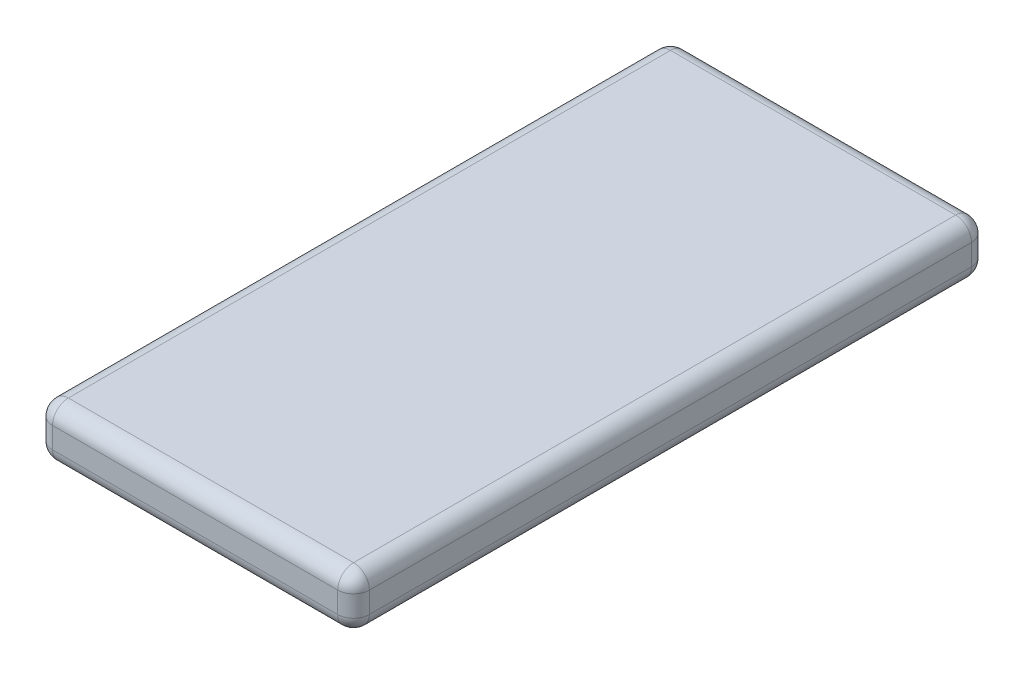
ISO-10303-21;
HEADER;
FILE_DESCRIPTION(('STEP AP214'),'2;1');
FILE_NAME('part.step','',(''),(''),'','','');
FILE_SCHEMA(('AUTOMOTIVE_DESIGN { 1 0 10303 214 1 1 1 1 }'));
ENDSEC;
DATA;
#1=APPLICATION_CONTEXT('core data for automotive mechanical design processes');
#2=APPLICATION_PROTOCOL_DEFINITION('international standard','automotive_design',2000,#1);
#3=PRODUCT_CONTEXT('',#1,'mechanical');
#4=PRODUCT('Part','Part','',(#3));
#5=PRODUCT_RELATED_PRODUCT_CATEGORY('part','',(#4));
#6=PRODUCT_DEFINITION_FORMATION('','',#4);
#7=PRODUCT_DEFINITION_CONTEXT('part definition',#1,'design');
#8=PRODUCT_DEFINITION('design','',#6,#7);
#9=PRODUCT_DEFINITION_SHAPE('','',#8);
#10=(LENGTH_UNIT() NAMED_UNIT(*) SI_UNIT(.MILLI.,.METRE.));
#11=(NAMED_UNIT(*) PLANE_ANGLE_UNIT() SI_UNIT($,.RADIAN.));
#12=(NAMED_UNIT(*) SI_UNIT($,.STERADIAN.) SOLID_ANGLE_UNIT());
#13=UNCERTAINTY_MEASURE_WITH_UNIT(LENGTH_MEASURE(1.E-05),#10,'distance_accuracy_value','');
#14=(GEOMETRIC_REPRESENTATION_CONTEXT(3) GLOBAL_UNCERTAINTY_ASSIGNED_CONTEXT((#13)) GLOBAL_UNIT_ASSIGNED_CONTEXT((#10,
#11,#12)) REPRESENTATION_CONTEXT('',''));
#15=CARTESIAN_POINT('',(0.,0.,0.));
#16=DIRECTION('',(0.,0.,1.));
#17=DIRECTION('',(1.,0.,0.));
#18=AXIS2_PLACEMENT_3D('',#15,#16,#17);
#19=CARTESIAN_POINT('',(-300.,100.,-600.));
#20=DIRECTION('',(1.,0.,0.));
#21=DIRECTION('',(0.,0.,-1.));
#22=AXIS2_PLACEMENT_3D('',#19,#20,#21);
#23=PLANE('',#22);
#24=DIRECTION('',(0.,0.,1.));
#25=VECTOR('',#24,1.);
#26=CARTESIAN_POINT('',(-300.,30.,600.));
#27=LINE('',#26,#25);
#28=CARTESIAN_POINT('',(-300.,30.,-570.));
#29=VERTEX_POINT('',#28);
#30=CARTESIAN_POINT('',(-300.,30.,570.));
#31=VERTEX_POINT('',#30);
#32=EDGE_CURVE('E327',#29,#31,#27,.T.);
#33=ORIENTED_EDGE('',*,*,#32,.T.);
#34=DIRECTION('',(0.,-1.,0.));
#35=VECTOR('',#34,1.);
#36=CARTESIAN_POINT('',(-300.,100.,570.));
#37=LINE('',#36,#35);
#38=CARTESIAN_POINT('',(-300.,70.,570.));
#39=VERTEX_POINT('',#38);
#40=EDGE_CURVE('E240',#31,#39,#37,.F.);
#41=ORIENTED_EDGE('',*,*,#40,.T.);
#42=DIRECTION('',(0.,0.,1.));
#43=VECTOR('',#42,1.);
#44=CARTESIAN_POINT('',(-300.,70.,-600.));
#45=LINE('',#44,#43);
#46=CARTESIAN_POINT('',(-300.,70.,-570.));
#47=VERTEX_POINT('',#46);
#48=EDGE_CURVE('E318',#39,#47,#45,.F.);
#49=ORIENTED_EDGE('',*,*,#48,.T.);
#50=DIRECTION('',(0.,-1.,0.));
#51=VECTOR('',#50,1.);
#52=CARTESIAN_POINT('',(-300.,100.,-570.));
#53=LINE('',#52,#51);
#54=EDGE_CURVE('E321',#47,#29,#53,.T.);
#55=ORIENTED_EDGE('',*,*,#54,.T.);
#56=EDGE_LOOP('',(#33,#41,#49,#55));
#57=FACE_BOUND('',#56,.T.);
#58=ADVANCED_FACE('F39',(#57),#23,.F.);
#59=CARTESIAN_POINT('',(300.,100.,600.));
#60=DIRECTION('',(0.,0.,-1.));
#61=DIRECTION('',(-1.,0.,0.));
#62=AXIS2_PLACEMENT_3D('',#59,#60,#61);
#63=PLANE('',#62);
#64=DIRECTION('',(0.,-1.,0.));
#65=VECTOR('',#64,1.);
#66=CARTESIAN_POINT('',(-270.,100.,600.));
#67=LINE('',#66,#65);
#68=CARTESIAN_POINT('',(-270.,70.,600.));
#69=VERTEX_POINT('',#68);
#70=CARTESIAN_POINT('',(-270.,30.,600.));
#71=VERTEX_POINT('',#70);
#72=EDGE_CURVE('E139',#69,#71,#67,.T.);
#73=ORIENTED_EDGE('',*,*,#72,.T.);
#74=DIRECTION('',(1.,0.,0.));
#75=VECTOR('',#74,1.);
#76=CARTESIAN_POINT('',(300.,30.,600.));
#77=LINE('',#76,#75);
#78=CARTESIAN_POINT('',(270.,30.,600.));
#79=VERTEX_POINT('',#78);
#80=EDGE_CURVE('E134',#71,#79,#77,.T.);
#81=ORIENTED_EDGE('',*,*,#80,.T.);
#82=DIRECTION('',(0.,-1.,0.));
#83=VECTOR('',#82,1.);
#84=CARTESIAN_POINT('',(270.,100.,600.));
#85=LINE('',#84,#83);
#86=CARTESIAN_POINT('',(270.,70.,600.));
#87=VERTEX_POINT('',#86);
#88=EDGE_CURVE('E128',#79,#87,#85,.F.);
#89=ORIENTED_EDGE('',*,*,#88,.T.);
#90=DIRECTION('',(1.,0.,0.));
#91=VECTOR('',#90,1.);
#92=CARTESIAN_POINT('',(300.,70.,600.));
#93=LINE('',#92,#91);
#94=EDGE_CURVE('E131',#87,#69,#93,.F.);
#95=ORIENTED_EDGE('',*,*,#94,.T.);
#96=EDGE_LOOP('',(#73,#81,#89,#95));
#97=FACE_BOUND('',#96,.T.);
#98=ADVANCED_FACE('F130',(#97),#63,.F.);
#99=CARTESIAN_POINT('',(300.,100.,-600.));
#100=DIRECTION('',(-1.,0.,0.));
#101=DIRECTION('',(0.,0.,1.));
#102=AXIS2_PLACEMENT_3D('',#99,#100,#101);
#103=PLANE('',#102);
#104=DIRECTION('',(0.,-1.,0.));
#105=VECTOR('',#104,1.);
#106=CARTESIAN_POINT('',(300.,100.,570.));
#107=LINE('',#106,#105);
#108=CARTESIAN_POINT('',(300.,70.,570.));
#109=VERTEX_POINT('',#108);
#110=CARTESIAN_POINT('',(300.,30.,570.));
#111=VERTEX_POINT('',#110);
#112=EDGE_CURVE('E163',#109,#111,#107,.T.);
#113=ORIENTED_EDGE('',*,*,#112,.T.);
#114=DIRECTION('',(0.,0.,-1.));
#115=VECTOR('',#114,1.);
#116=CARTESIAN_POINT('',(300.,30.,-600.));
#117=LINE('',#116,#115);
#118=CARTESIAN_POINT('',(300.,30.,-570.));
#119=VERTEX_POINT('',#118);
#120=EDGE_CURVE('E264',#111,#119,#117,.T.);
#121=ORIENTED_EDGE('',*,*,#120,.T.);
#122=DIRECTION('',(0.,-1.,0.));
#123=VECTOR('',#122,1.);
#124=CARTESIAN_POINT('',(300.,100.,-570.));
#125=LINE('',#124,#123);
#126=CARTESIAN_POINT('',(300.,70.,-570.));
#127=VERTEX_POINT('',#126);
#128=EDGE_CURVE('E255',#119,#127,#125,.F.);
#129=ORIENTED_EDGE('',*,*,#128,.T.);
#130=DIRECTION('',(0.,0.,-1.));
#131=VECTOR('',#130,1.);
#132=CARTESIAN_POINT('',(300.,70.,-600.));
#133=LINE('',#132,#131);
#134=EDGE_CURVE('E251',#127,#109,#133,.F.);
#135=ORIENTED_EDGE('',*,*,#134,.T.);
#136=EDGE_LOOP('',(#113,#121,#129,#135));
#137=FACE_BOUND('',#136,.T.);
#138=ADVANCED_FACE('F378',(#137),#103,.F.);
#139=CARTESIAN_POINT('',(300.,100.,-600.));
#140=DIRECTION('',(0.,0.,1.));
#141=DIRECTION('',(1.,0.,0.));
#142=AXIS2_PLACEMENT_3D('',#139,#140,#141);
#143=PLANE('',#142);
#144=DIRECTION('',(-1.,0.,0.));
#145=VECTOR('',#144,1.);
#146=CARTESIAN_POINT('',(-300.,30.,-600.));
#147=LINE('',#146,#145);
#148=CARTESIAN_POINT('',(270.,30.,-600.));
#149=VERTEX_POINT('',#148);
#150=CARTESIAN_POINT('',(-270.,30.,-600.));
#151=VERTEX_POINT('',#150);
#152=EDGE_CURVE('E246',#149,#151,#147,.T.);
#153=ORIENTED_EDGE('',*,*,#152,.T.);
#154=DIRECTION('',(0.,-1.,0.));
#155=VECTOR('',#154,1.);
#156=CARTESIAN_POINT('',(-270.,100.,-600.));
#157=LINE('',#156,#155);
#158=CARTESIAN_POINT('',(-270.,70.,-600.));
#159=VERTEX_POINT('',#158);
#160=EDGE_CURVE('E243',#151,#159,#157,.F.);
#161=ORIENTED_EDGE('',*,*,#160,.T.);
#162=DIRECTION('',(-1.,0.,0.));
#163=VECTOR('',#162,1.);
#164=CARTESIAN_POINT('',(300.,70.,-600.));
#165=LINE('',#164,#163);
#166=CARTESIAN_POINT('',(270.,70.,-600.));
#167=VERTEX_POINT('',#166);
#168=EDGE_CURVE('E235',#159,#167,#165,.F.);
#169=ORIENTED_EDGE('',*,*,#168,.T.);
#170=DIRECTION('',(0.,-1.,0.));
#171=VECTOR('',#170,1.);
#172=CARTESIAN_POINT('',(270.,100.,-600.));
#173=LINE('',#172,#171);
#174=EDGE_CURVE('E239',#167,#149,#173,.T.);
#175=ORIENTED_EDGE('',*,*,#174,.T.);
#176=EDGE_LOOP('',(#153,#161,#169,#175));
#177=FACE_BOUND('',#176,.T.);
#178=ADVANCED_FACE('F244',(#177),#143,.F.);
#179=CARTESIAN_POINT('',(0.,100.,0.));
#180=DIRECTION('',(0.,-1.,0.));
#181=DIRECTION('',(0.,0.,-1.));
#182=AXIS2_PLACEMENT_3D('',#179,#180,#181);
#183=PLANE('',#182);
#184=DIRECTION('',(0.,0.,-1.));
#185=VECTOR('',#184,1.);
#186=CARTESIAN_POINT('',(270.,100.,0.));
#187=LINE('',#186,#185);
#188=CARTESIAN_POINT('',(270.,100.,570.));
#189=VERTEX_POINT('',#188);
#190=CARTESIAN_POINT('',(270.,100.,-570.));
#191=VERTEX_POINT('',#190);
#192=EDGE_CURVE('E49',#189,#191,#187,.T.);
#193=ORIENTED_EDGE('',*,*,#192,.T.);
#194=DIRECTION('',(-1.,0.,0.));
#195=VECTOR('',#194,1.);
#196=CARTESIAN_POINT('',(-1.0547118733939E-13,100.,-570.));
#197=LINE('',#196,#195);
#198=CARTESIAN_POINT('',(-270.,100.,-570.));
#199=VERTEX_POINT('',#198);
#200=EDGE_CURVE('E11',#191,#199,#197,.T.);
#201=ORIENTED_EDGE('',*,*,#200,.T.);
#202=DIRECTION('',(0.,0.,1.));
#203=VECTOR('',#202,1.);
#204=CARTESIAN_POINT('',(-270.,100.,0.));
#205=LINE('',#204,#203);
#206=CARTESIAN_POINT('',(-270.,100.,570.));
#207=VERTEX_POINT('',#206);
#208=EDGE_CURVE('E267',#199,#207,#205,.T.);
#209=ORIENTED_EDGE('',*,*,#208,.T.);
#210=DIRECTION('',(1.,0.,0.));
#211=VECTOR('',#210,1.);
#212=CARTESIAN_POINT('',(0.,100.,570.));
#213=LINE('',#212,#211);
#214=EDGE_CURVE('E60',#207,#189,#213,.T.);
#215=ORIENTED_EDGE('',*,*,#214,.T.);
#216=EDGE_LOOP('',(#193,#201,#209,#215));
#217=FACE_BOUND('',#216,.T.);
#218=ADVANCED_FACE('F536',(#217),#183,.F.);
#219=CARTESIAN_POINT('',(0.,0.,0.));
#220=DIRECTION('',(0.,-1.,0.));
#221=DIRECTION('',(0.,0.,-1.));
#222=AXIS2_PLACEMENT_3D('',#219,#220,#221);
#223=PLANE('',#222);
#224=DIRECTION('',(0.,0.,-1.));
#225=VECTOR('',#224,1.);
#226=CARTESIAN_POINT('',(270.,0.,600.));
#227=LINE('',#226,#225);
#228=CARTESIAN_POINT('',(270.,0.,-570.));
#229=VERTEX_POINT('',#228);
#230=CARTESIAN_POINT('',(270.,0.,570.));
#231=VERTEX_POINT('',#230);
#232=EDGE_CURVE('E313',#229,#231,#227,.F.);
#233=ORIENTED_EDGE('',*,*,#232,.T.);
#234=DIRECTION('',(1.,0.,0.));
#235=VECTOR('',#234,1.);
#236=CARTESIAN_POINT('',(-300.,0.,570.));
#237=LINE('',#236,#235);
#238=CARTESIAN_POINT('',(-270.,0.,570.));
#239=VERTEX_POINT('',#238);
#240=EDGE_CURVE('E307',#231,#239,#237,.F.);
#241=ORIENTED_EDGE('',*,*,#240,.T.);
#242=DIRECTION('',(0.,0.,1.));
#243=VECTOR('',#242,1.);
#244=CARTESIAN_POINT('',(-270.,0.,-600.));
#245=LINE('',#244,#243);
#246=CARTESIAN_POINT('',(-270.,0.,-570.));
#247=VERTEX_POINT('',#246);
#248=EDGE_CURVE('E300',#239,#247,#245,.F.);
#249=ORIENTED_EDGE('',*,*,#248,.T.);
#250=DIRECTION('',(-1.,0.,0.));
#251=VECTOR('',#250,1.);
#252=CARTESIAN_POINT('',(300.,0.,-570.));
#253=LINE('',#252,#251);
#254=EDGE_CURVE('E308',#247,#229,#253,.F.);
#255=ORIENTED_EDGE('',*,*,#254,.T.);
#256=EDGE_LOOP('',(#233,#241,#249,#255));
#257=FACE_BOUND('',#256,.T.);
#258=ADVANCED_FACE('F311',(#257),#223,.T.);
#259=CARTESIAN_POINT('',(-1.0547118733939E-13,70.,-570.));
#260=DIRECTION('',(-1.,0.,0.));
#261=DIRECTION('',(0.,0.,1.));
#262=AXIS2_PLACEMENT_3D('',#259,#260,#261);
#263=CYLINDRICAL_SURFACE('',#262,30.);
#264=CARTESIAN_POINT('',(-270.,70.,-570.));
#265=DIRECTION('',(-1.,0.,0.));
#266=DIRECTION('',(0.,0.,1.));
#267=AXIS2_PLACEMENT_3D('',#264,#265,#266);
#268=CIRCLE('',#267,30.);
#269=EDGE_CURVE('E43',#199,#159,#268,.T.);
#270=ORIENTED_EDGE('',*,*,#269,.F.);
#271=ORIENTED_EDGE('',*,*,#200,.F.);
#272=CARTESIAN_POINT('',(270.,70.,-570.));
#273=DIRECTION('',(1.,0.,0.));
#274=DIRECTION('',(0.,0.,-1.));
#275=AXIS2_PLACEMENT_3D('',#272,#273,#274);
#276=CIRCLE('',#275,30.);
#277=EDGE_CURVE('E218',#167,#191,#276,.T.);
#278=ORIENTED_EDGE('',*,*,#277,.F.);
#279=ORIENTED_EDGE('',*,*,#168,.F.);
#280=EDGE_LOOP('',(#270,#271,#278,#279));
#281=FACE_BOUND('',#280,.T.);
#282=ADVANCED_FACE('F41',(#281),#263,.T.);
#283=CARTESIAN_POINT('',(-270.,70.,-570.));
#284=DIRECTION('',(0.,0.,1.));
#285=DIRECTION('',(1.,0.,0.));
#286=AXIS2_PLACEMENT_3D('',#283,#284,#285);
#287=SPHERICAL_SURFACE('',#286,30.);
#288=CARTESIAN_POINT('',(-270.,70.,-570.));
#289=DIRECTION('',(0.,0.,-1.));
#290=DIRECTION('',(0.,1.,0.));
#291=AXIS2_PLACEMENT_3D('',#288,#289,#290);
#292=CIRCLE('',#291,30.);
#293=EDGE_CURVE('E212',#199,#47,#292,.F.);
#294=ORIENTED_EDGE('',*,*,#293,.F.);
#295=ORIENTED_EDGE('',*,*,#269,.T.);
#296=CARTESIAN_POINT('',(-270.,70.,-570.));
#297=DIRECTION('',(0.,1.,0.));
#298=DIRECTION('',(0.,0.,1.));
#299=AXIS2_PLACEMENT_3D('',#296,#297,#298);
#300=CIRCLE('',#299,30.);
#301=EDGE_CURVE('E216',#47,#159,#300,.F.);
#302=ORIENTED_EDGE('',*,*,#301,.F.);
#303=EDGE_LOOP('',(#294,#295,#302));
#304=FACE_BOUND('',#303,.T.);
#305=ADVANCED_FACE('F232',(#304),#287,.T.);
#306=CARTESIAN_POINT('',(270.,70.,-570.));
#307=DIRECTION('',(0.,0.,1.));
#308=DIRECTION('',(1.,0.,0.));
#309=AXIS2_PLACEMENT_3D('',#306,#307,#308);
#310=SPHERICAL_SURFACE('',#309,30.);
#311=CARTESIAN_POINT('',(270.,70.,-570.));
#312=DIRECTION('',(0.,1.,0.));
#313=DIRECTION('',(0.,0.,1.));
#314=AXIS2_PLACEMENT_3D('',#311,#312,#313);
#315=CIRCLE('',#314,30.);
#316=EDGE_CURVE('E204',#167,#127,#315,.F.);
#317=ORIENTED_EDGE('',*,*,#316,.F.);
#318=ORIENTED_EDGE('',*,*,#277,.T.);
#319=CARTESIAN_POINT('',(270.,70.,-570.));
#320=DIRECTION('',(0.,0.,-1.));
#321=DIRECTION('',(-1.,0.,0.));
#322=AXIS2_PLACEMENT_3D('',#319,#320,#321);
#323=CIRCLE('',#322,30.);
#324=EDGE_CURVE('E208',#127,#191,#323,.F.);
#325=ORIENTED_EDGE('',*,*,#324,.F.);
#326=EDGE_LOOP('',(#317,#318,#325));
#327=FACE_BOUND('',#326,.T.);
#328=ADVANCED_FACE('F509',(#327),#310,.T.);
#329=CARTESIAN_POINT('',(-270.,100.,-570.));
#330=DIRECTION('',(0.,-1.,0.));
#331=DIRECTION('',(0.,0.,-1.));
#332=AXIS2_PLACEMENT_3D('',#329,#330,#331);
#333=CYLINDRICAL_SURFACE('',#332,30.);
#334=ORIENTED_EDGE('',*,*,#301,.T.);
#335=ORIENTED_EDGE('',*,*,#160,.F.);
#336=CARTESIAN_POINT('',(-270.,30.,-570.));
#337=DIRECTION('',(0.,-1.,0.));
#338=DIRECTION('',(0.,0.,-1.));
#339=AXIS2_PLACEMENT_3D('',#336,#337,#338);
#340=CIRCLE('',#339,30.);
#341=EDGE_CURVE('E196',#29,#151,#340,.T.);
#342=ORIENTED_EDGE('',*,*,#341,.F.);
#343=ORIENTED_EDGE('',*,*,#54,.F.);
#344=EDGE_LOOP('',(#334,#335,#342,#343));
#345=FACE_BOUND('',#344,.T.);
#346=ADVANCED_FACE('F360',(#345),#333,.T.);
#347=CARTESIAN_POINT('',(-270.,70.,0.));
#348=DIRECTION('',(0.,0.,1.));
#349=DIRECTION('',(1.,0.,0.));
#350=AXIS2_PLACEMENT_3D('',#347,#348,#349);
#351=CYLINDRICAL_SURFACE('',#350,30.);
#352=ORIENTED_EDGE('',*,*,#293,.T.);
#353=ORIENTED_EDGE('',*,*,#48,.F.);
#354=CARTESIAN_POINT('',(-270.,70.,570.));
#355=DIRECTION('',(0.,0.,1.));
#356=DIRECTION('',(1.,0.,0.));
#357=AXIS2_PLACEMENT_3D('',#354,#355,#356);
#358=CIRCLE('',#357,30.);
#359=EDGE_CURVE('E192',#207,#39,#358,.T.);
#360=ORIENTED_EDGE('',*,*,#359,.F.);
#361=ORIENTED_EDGE('',*,*,#208,.F.);
#362=EDGE_LOOP('',(#352,#353,#360,#361));
#363=FACE_BOUND('',#362,.T.);
#364=ADVANCED_FACE('F493',(#363),#351,.T.);
#365=CARTESIAN_POINT('',(0.,70.,570.));
#366=DIRECTION('',(1.,0.,0.));
#367=DIRECTION('',(0.,0.,-1.));
#368=AXIS2_PLACEMENT_3D('',#365,#366,#367);
#369=CYLINDRICAL_SURFACE('',#368,30.);
#370=CARTESIAN_POINT('',(270.,70.,570.));
#371=DIRECTION('',(1.,0.,0.));
#372=DIRECTION('',(0.,0.,-1.));
#373=AXIS2_PLACEMENT_3D('',#370,#371,#372);
#374=CIRCLE('',#373,30.);
#375=EDGE_CURVE('E145',#189,#87,#374,.T.);
#376=ORIENTED_EDGE('',*,*,#375,.F.);
#377=ORIENTED_EDGE('',*,*,#214,.F.);
#378=CARTESIAN_POINT('',(-270.,70.,570.));
#379=DIRECTION('',(-1.,0.,0.));
#380=DIRECTION('',(0.,-1.,0.));
#381=AXIS2_PLACEMENT_3D('',#378,#379,#380);
#382=CIRCLE('',#381,30.);
#383=EDGE_CURVE('E148',#69,#207,#382,.T.);
#384=ORIENTED_EDGE('',*,*,#383,.F.);
#385=ORIENTED_EDGE('',*,*,#94,.F.);
#386=EDGE_LOOP('',(#376,#377,#384,#385));
#387=FACE_BOUND('',#386,.T.);
#388=ADVANCED_FACE('F144',(#387),#369,.T.);
#389=CARTESIAN_POINT('',(270.,70.,0.));
#390=DIRECTION('',(0.,0.,-1.));
#391=DIRECTION('',(-1.,0.,0.));
#392=AXIS2_PLACEMENT_3D('',#389,#390,#391);
#393=CYLINDRICAL_SURFACE('',#392,30.);
#394=ORIENTED_EDGE('',*,*,#324,.T.);
#395=ORIENTED_EDGE('',*,*,#192,.F.);
#396=CARTESIAN_POINT('',(270.,70.,570.));
#397=DIRECTION('',(0.,0.,1.));
#398=DIRECTION('',(0.,-1.,0.));
#399=AXIS2_PLACEMENT_3D('',#396,#397,#398);
#400=CIRCLE('',#399,30.);
#401=EDGE_CURVE('E158',#109,#189,#400,.T.);
#402=ORIENTED_EDGE('',*,*,#401,.F.);
#403=ORIENTED_EDGE('',*,*,#134,.F.);
#404=EDGE_LOOP('',(#394,#395,#402,#403));
#405=FACE_BOUND('',#404,.T.);
#406=ADVANCED_FACE('F477',(#405),#393,.T.);
#407=CARTESIAN_POINT('',(270.,100.,-570.));
#408=DIRECTION('',(0.,-1.,0.));
#409=DIRECTION('',(0.,0.,-1.));
#410=AXIS2_PLACEMENT_3D('',#407,#408,#409);
#411=CYLINDRICAL_SURFACE('',#410,30.);
#412=ORIENTED_EDGE('',*,*,#316,.T.);
#413=ORIENTED_EDGE('',*,*,#128,.F.);
#414=CARTESIAN_POINT('',(270.,30.,-570.));
#415=DIRECTION('',(0.,-1.,0.));
#416=DIRECTION('',(0.,0.,-1.));
#417=AXIS2_PLACEMENT_3D('',#414,#415,#416);
#418=CIRCLE('',#417,30.);
#419=EDGE_CURVE('E184',#149,#119,#418,.T.);
#420=ORIENTED_EDGE('',*,*,#419,.F.);
#421=ORIENTED_EDGE('',*,*,#174,.F.);
#422=EDGE_LOOP('',(#412,#413,#420,#421));
#423=FACE_BOUND('',#422,.T.);
#424=ADVANCED_FACE('F341',(#423),#411,.T.);
#425=CARTESIAN_POINT('',(300.,30.,-570.));
#426=DIRECTION('',(1.,0.,0.));
#427=DIRECTION('',(0.,0.,-1.));
#428=AXIS2_PLACEMENT_3D('',#425,#426,#427);
#429=CYLINDRICAL_SURFACE('',#428,30.);
#430=CARTESIAN_POINT('',(-270.,30.,-570.));
#431=DIRECTION('',(-1.,0.,0.));
#432=DIRECTION('',(0.,0.,1.));
#433=AXIS2_PLACEMENT_3D('',#430,#431,#432);
#434=CIRCLE('',#433,30.);
#435=EDGE_CURVE('E200',#151,#247,#434,.T.);
#436=ORIENTED_EDGE('',*,*,#435,.F.);
#437=ORIENTED_EDGE('',*,*,#152,.F.);
#438=CARTESIAN_POINT('',(270.,30.,-570.));
#439=DIRECTION('',(1.,0.,0.));
#440=DIRECTION('',(0.,0.,-1.));
#441=AXIS2_PLACEMENT_3D('',#438,#439,#440);
#442=CIRCLE('',#441,30.);
#443=EDGE_CURVE('E180',#229,#149,#442,.T.);
#444=ORIENTED_EDGE('',*,*,#443,.F.);
#445=ORIENTED_EDGE('',*,*,#254,.F.);
#446=EDGE_LOOP('',(#436,#437,#444,#445));
#447=FACE_BOUND('',#446,.T.);
#448=ADVANCED_FACE('F338',(#447),#429,.T.);
#449=CARTESIAN_POINT('',(-270.,30.,-570.));
#450=DIRECTION('',(0.,0.,1.));
#451=DIRECTION('',(1.,0.,0.));
#452=AXIS2_PLACEMENT_3D('',#449,#450,#451);
#453=SPHERICAL_SURFACE('',#452,30.);
#454=ORIENTED_EDGE('',*,*,#341,.T.);
#455=ORIENTED_EDGE('',*,*,#435,.T.);
#456=CARTESIAN_POINT('',(-270.,30.,-570.));
#457=DIRECTION('',(0.,0.,-1.));
#458=DIRECTION('',(-1.,0.,0.));
#459=AXIS2_PLACEMENT_3D('',#456,#457,#458);
#460=CIRCLE('',#459,30.);
#461=EDGE_CURVE('E170',#29,#247,#460,.F.);
#462=ORIENTED_EDGE('',*,*,#461,.F.);
#463=EDGE_LOOP('',(#454,#455,#462));
#464=FACE_BOUND('',#463,.T.);
#465=ADVANCED_FACE('F362',(#464),#453,.T.);
#466=CARTESIAN_POINT('',(-270.,70.,570.));
#467=DIRECTION('',(0.,0.,1.));
#468=DIRECTION('',(1.,0.,0.));
#469=AXIS2_PLACEMENT_3D('',#466,#467,#468);
#470=SPHERICAL_SURFACE('',#469,30.);
#471=ORIENTED_EDGE('',*,*,#383,.T.);
#472=ORIENTED_EDGE('',*,*,#359,.T.);
#473=CARTESIAN_POINT('',(-270.,70.,570.));
#474=DIRECTION('',(0.,1.,0.));
#475=DIRECTION('',(0.,0.,1.));
#476=AXIS2_PLACEMENT_3D('',#473,#474,#475);
#477=CIRCLE('',#476,30.);
#478=EDGE_CURVE('E165',#69,#39,#477,.F.);
#479=ORIENTED_EDGE('',*,*,#478,.F.);
#480=EDGE_LOOP('',(#471,#472,#479));
#481=FACE_BOUND('',#480,.T.);
#482=ADVANCED_FACE('F364',(#481),#470,.T.);
#483=CARTESIAN_POINT('',(270.,70.,570.));
#484=DIRECTION('',(0.,0.,1.));
#485=DIRECTION('',(1.,0.,0.));
#486=AXIS2_PLACEMENT_3D('',#483,#484,#485);
#487=SPHERICAL_SURFACE('',#486,30.);
#488=ORIENTED_EDGE('',*,*,#401,.T.);
#489=ORIENTED_EDGE('',*,*,#375,.T.);
#490=CARTESIAN_POINT('',(270.,70.,570.));
#491=DIRECTION('',(0.,1.,0.));
#492=DIRECTION('',(0.,0.,1.));
#493=AXIS2_PLACEMENT_3D('',#490,#491,#492);
#494=CIRCLE('',#493,30.);
#495=EDGE_CURVE('E155',#109,#87,#494,.F.);
#496=ORIENTED_EDGE('',*,*,#495,.F.);
#497=EDGE_LOOP('',(#488,#489,#496));
#498=FACE_BOUND('',#497,.T.);
#499=ADVANCED_FACE('F154',(#498),#487,.T.);
#500=CARTESIAN_POINT('',(270.,30.,-570.));
#501=DIRECTION('',(0.,0.,1.));
#502=DIRECTION('',(1.,0.,0.));
#503=AXIS2_PLACEMENT_3D('',#500,#501,#502);
#504=SPHERICAL_SURFACE('',#503,30.);
#505=ORIENTED_EDGE('',*,*,#443,.T.);
#506=ORIENTED_EDGE('',*,*,#419,.T.);
#507=CARTESIAN_POINT('',(270.,30.,-570.));
#508=DIRECTION('',(0.,0.,-1.));
#509=DIRECTION('',(-1.,0.,0.));
#510=AXIS2_PLACEMENT_3D('',#507,#508,#509);
#511=CIRCLE('',#510,30.);
#512=EDGE_CURVE('E166',#229,#119,#511,.F.);
#513=ORIENTED_EDGE('',*,*,#512,.F.);
#514=EDGE_LOOP('',(#505,#506,#513));
#515=FACE_BOUND('',#514,.T.);
#516=ADVANCED_FACE('F343',(#515),#504,.T.);
#517=CARTESIAN_POINT('',(-270.,30.,-600.));
#518=DIRECTION('',(0.,0.,-1.));
#519=DIRECTION('',(-1.,0.,0.));
#520=AXIS2_PLACEMENT_3D('',#517,#518,#519);
#521=CYLINDRICAL_SURFACE('',#520,30.);
#522=ORIENTED_EDGE('',*,*,#461,.T.);
#523=ORIENTED_EDGE('',*,*,#248,.F.);
#524=CARTESIAN_POINT('',(-270.,30.,570.));
#525=DIRECTION('',(0.,0.,1.));
#526=DIRECTION('',(1.,0.,0.));
#527=AXIS2_PLACEMENT_3D('',#524,#525,#526);
#528=CIRCLE('',#527,30.);
#529=EDGE_CURVE('E173',#31,#239,#528,.T.);
#530=ORIENTED_EDGE('',*,*,#529,.F.);
#531=ORIENTED_EDGE('',*,*,#32,.F.);
#532=EDGE_LOOP('',(#522,#523,#530,#531));
#533=FACE_BOUND('',#532,.T.);
#534=ADVANCED_FACE('F302',(#533),#521,.T.);
#535=CARTESIAN_POINT('',(-270.,100.,570.));
#536=DIRECTION('',(0.,-1.,0.));
#537=DIRECTION('',(0.,0.,-1.));
#538=AXIS2_PLACEMENT_3D('',#535,#536,#537);
#539=CYLINDRICAL_SURFACE('',#538,30.);
#540=ORIENTED_EDGE('',*,*,#478,.T.);
#541=ORIENTED_EDGE('',*,*,#40,.F.);
#542=CARTESIAN_POINT('',(-270.,30.,570.));
#543=DIRECTION('',(0.,-1.,0.));
#544=DIRECTION('',(0.,0.,-1.));
#545=AXIS2_PLACEMENT_3D('',#542,#543,#544);
#546=CIRCLE('',#545,30.);
#547=EDGE_CURVE('E287',#71,#31,#546,.T.);
#548=ORIENTED_EDGE('',*,*,#547,.F.);
#549=ORIENTED_EDGE('',*,*,#72,.F.);
#550=EDGE_LOOP('',(#540,#541,#548,#549));
#551=FACE_BOUND('',#550,.T.);
#552=ADVANCED_FACE('F357',(#551),#539,.T.);
#553=CARTESIAN_POINT('',(270.,100.,570.));
#554=DIRECTION('',(0.,-1.,0.));
#555=DIRECTION('',(0.,0.,-1.));
#556=AXIS2_PLACEMENT_3D('',#553,#554,#555);
#557=CYLINDRICAL_SURFACE('',#556,30.);
#558=ORIENTED_EDGE('',*,*,#495,.T.);
#559=ORIENTED_EDGE('',*,*,#88,.F.);
#560=CARTESIAN_POINT('',(270.,30.,570.));
#561=DIRECTION('',(0.,-1.,0.));
#562=DIRECTION('',(0.,0.,-1.));
#563=AXIS2_PLACEMENT_3D('',#560,#561,#562);
#564=CIRCLE('',#563,30.);
#565=EDGE_CURVE('E283',#111,#79,#564,.T.);
#566=ORIENTED_EDGE('',*,*,#565,.F.);
#567=ORIENTED_EDGE('',*,*,#112,.F.);
#568=EDGE_LOOP('',(#558,#559,#566,#567));
#569=FACE_BOUND('',#568,.T.);
#570=ADVANCED_FACE('F161',(#569),#557,.T.);
#571=CARTESIAN_POINT('',(270.,30.,-600.));
#572=DIRECTION('',(0.,0.,1.));
#573=DIRECTION('',(1.,0.,0.));
#574=AXIS2_PLACEMENT_3D('',#571,#572,#573);
#575=CYLINDRICAL_SURFACE('',#574,30.);
#576=ORIENTED_EDGE('',*,*,#512,.T.);
#577=ORIENTED_EDGE('',*,*,#120,.F.);
#578=CARTESIAN_POINT('',(270.,30.,570.));
#579=DIRECTION('',(0.,0.,1.));
#580=DIRECTION('',(1.,0.,0.));
#581=AXIS2_PLACEMENT_3D('',#578,#579,#580);
#582=CIRCLE('',#581,30.);
#583=EDGE_CURVE('E280',#231,#111,#582,.T.);
#584=ORIENTED_EDGE('',*,*,#583,.F.);
#585=ORIENTED_EDGE('',*,*,#232,.F.);
#586=EDGE_LOOP('',(#576,#577,#584,#585));
#587=FACE_BOUND('',#586,.T.);
#588=ADVANCED_FACE('F346',(#587),#575,.T.);
#589=CARTESIAN_POINT('',(-270.,30.,570.));
#590=DIRECTION('',(0.,0.,1.));
#591=DIRECTION('',(1.,0.,0.));
#592=AXIS2_PLACEMENT_3D('',#589,#590,#591);
#593=SPHERICAL_SURFACE('',#592,30.);
#594=ORIENTED_EDGE('',*,*,#547,.T.);
#595=ORIENTED_EDGE('',*,*,#529,.T.);
#596=CARTESIAN_POINT('',(-270.,30.,570.));
#597=DIRECTION('',(-1.,0.,0.));
#598=DIRECTION('',(0.,0.,1.));
#599=AXIS2_PLACEMENT_3D('',#596,#597,#598);
#600=CIRCLE('',#599,30.);
#601=EDGE_CURVE('E277',#71,#239,#600,.F.);
#602=ORIENTED_EDGE('',*,*,#601,.F.);
#603=EDGE_LOOP('',(#594,#595,#602));
#604=FACE_BOUND('',#603,.T.);
#605=ADVANCED_FACE('F296',(#604),#593,.T.);
#606=CARTESIAN_POINT('',(270.,30.,570.));
#607=DIRECTION('',(0.,0.,1.));
#608=DIRECTION('',(1.,0.,0.));
#609=AXIS2_PLACEMENT_3D('',#606,#607,#608);
#610=SPHERICAL_SURFACE('',#609,30.);
#611=ORIENTED_EDGE('',*,*,#583,.T.);
#612=ORIENTED_EDGE('',*,*,#565,.T.);
#613=CARTESIAN_POINT('',(270.,30.,570.));
#614=DIRECTION('',(1.,0.,0.));
#615=DIRECTION('',(0.,0.,-1.));
#616=AXIS2_PLACEMENT_3D('',#613,#614,#615);
#617=CIRCLE('',#616,30.);
#618=EDGE_CURVE('E274',#231,#79,#617,.F.);
#619=ORIENTED_EDGE('',*,*,#618,.F.);
#620=EDGE_LOOP('',(#611,#612,#619));
#621=FACE_BOUND('',#620,.T.);
#622=ADVANCED_FACE('F385',(#621),#610,.T.);
#623=CARTESIAN_POINT('',(300.,30.,570.));
#624=DIRECTION('',(-1.,0.,0.));
#625=DIRECTION('',(0.,0.,1.));
#626=AXIS2_PLACEMENT_3D('',#623,#624,#625);
#627=CYLINDRICAL_SURFACE('',#626,30.);
#628=ORIENTED_EDGE('',*,*,#601,.T.);
#629=ORIENTED_EDGE('',*,*,#240,.F.);
#630=ORIENTED_EDGE('',*,*,#618,.T.);
#631=ORIENTED_EDGE('',*,*,#80,.F.);
#632=EDGE_LOOP('',(#628,#629,#630,#631));
#633=FACE_BOUND('',#632,.T.);
#634=ADVANCED_FACE('F382',(#633),#627,.T.);
#635=CLOSED_SHELL('',(#58,#98,#138,#178,#218,#258,#282,#305,#328,#346,#364,#388,#406,#424,#448,
#465,#482,#499,#516,#534,#552,#570,#588,#605,#622,#634));
#636=MANIFOLD_SOLID_BREP('B2',#635);
#637=ADVANCED_BREP_SHAPE_REPRESENTATION('',(#18,#636),#14);
#638=SHAPE_DEFINITION_REPRESENTATION(#9,#637);
ENDSEC;
END-ISO-10303-21;
